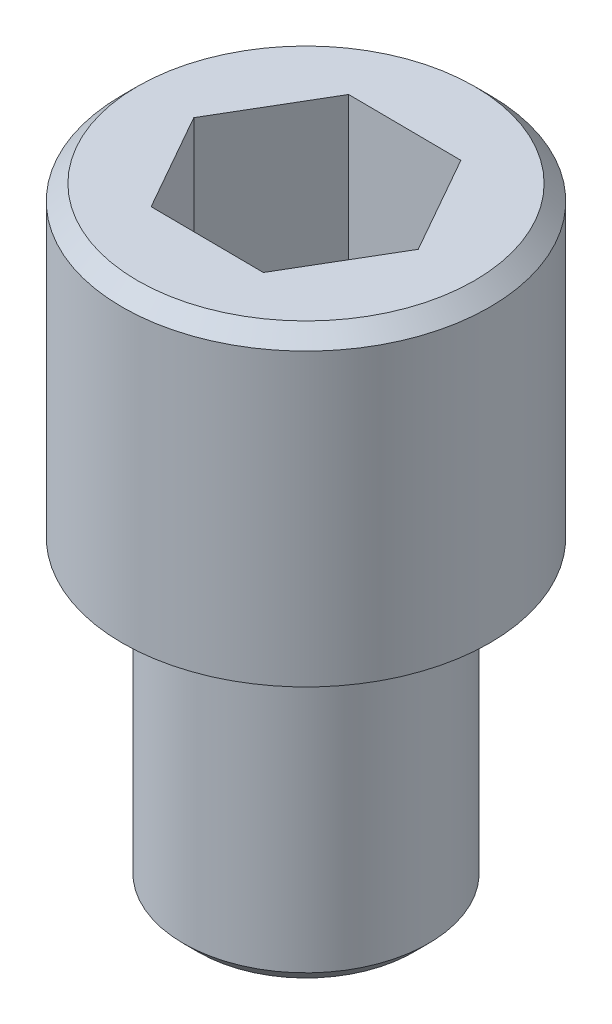
ISO-10303-21;
HEADER;
FILE_DESCRIPTION(('STEP AP214'),'2;1');
FILE_NAME('part.step','',(''),(''),'','','');
FILE_SCHEMA(('AUTOMOTIVE_DESIGN { 1 0 10303 214 1 1 1 1 }'));
ENDSEC;
DATA;
#1=APPLICATION_CONTEXT('core data for automotive mechanical design processes');
#2=APPLICATION_PROTOCOL_DEFINITION('international standard','automotive_design',2000,#1);
#3=PRODUCT_CONTEXT('',#1,'mechanical');
#4=PRODUCT('Part','Part','',(#3));
#5=PRODUCT_RELATED_PRODUCT_CATEGORY('part','',(#4));
#6=PRODUCT_DEFINITION_FORMATION('','',#4);
#7=PRODUCT_DEFINITION_CONTEXT('part definition',#1,'design');
#8=PRODUCT_DEFINITION('design','',#6,#7);
#9=PRODUCT_DEFINITION_SHAPE('','',#8);
#10=(LENGTH_UNIT() NAMED_UNIT(*) SI_UNIT(.MILLI.,.METRE.));
#11=(NAMED_UNIT(*) PLANE_ANGLE_UNIT() SI_UNIT($,.RADIAN.));
#12=(NAMED_UNIT(*) SI_UNIT($,.STERADIAN.) SOLID_ANGLE_UNIT());
#13=UNCERTAINTY_MEASURE_WITH_UNIT(LENGTH_MEASURE(1.E-05),#10,'distance_accuracy_value','');
#14=(GEOMETRIC_REPRESENTATION_CONTEXT(3) GLOBAL_UNCERTAINTY_ASSIGNED_CONTEXT((#13)) GLOBAL_UNIT_ASSIGNED_CONTEXT((#10,
#11,#12)) REPRESENTATION_CONTEXT('',''));
#15=CARTESIAN_POINT('',(0.,0.,0.));
#16=DIRECTION('',(0.,0.,1.));
#17=DIRECTION('',(1.,0.,0.));
#18=AXIS2_PLACEMENT_3D('',#15,#16,#17);
#19=CARTESIAN_POINT('',(0.,5.,0.));
#20=DIRECTION('',(0.,-1.,0.));
#21=DIRECTION('',(0.,0.,-1.));
#22=AXIS2_PLACEMENT_3D('',#19,#20,#21);
#23=CYLINDRICAL_SURFACE('',#22,2.);
#24=CARTESIAN_POINT('',(0.,0.250000000000001,0.));
#25=DIRECTION('',(0.,1.,0.));
#26=DIRECTION('',(0.,0.,1.));
#27=AXIS2_PLACEMENT_3D('',#24,#25,#26);
#28=CIRCLE('',#27,2.);
#29=CARTESIAN_POINT('',(0.,0.250000000000001,2.));
#30=VERTEX_POINT('',#29);
#31=EDGE_CURVE('E146',#30,#30,#28,.T.);
#32=ORIENTED_EDGE('',*,*,#31,.T.);
#33=EDGE_LOOP('',(#32));
#34=FACE_BOUND('',#33,.T.);
#35=CARTESIAN_POINT('',(0.,5.,0.));
#36=DIRECTION('',(0.,1.,0.));
#37=DIRECTION('',(0.,0.,1.));
#38=AXIS2_PLACEMENT_3D('',#35,#36,#37);
#39=CIRCLE('',#38,2.);
#40=CARTESIAN_POINT('',(0.,5.,2.));
#41=VERTEX_POINT('',#40);
#42=EDGE_CURVE('E143',#41,#41,#39,.T.);
#43=ORIENTED_EDGE('',*,*,#42,.F.);
#44=EDGE_LOOP('',(#43));
#45=FACE_BOUND('',#44,.T.);
#46=ADVANCED_FACE('F33',(#34,#45),#23,.T.);
#47=CARTESIAN_POINT('',(0.,0.,0.));
#48=DIRECTION('',(0.,1.,0.));
#49=DIRECTION('',(0.,0.,1.));
#50=AXIS2_PLACEMENT_3D('',#47,#48,#49);
#51=PLANE('',#50);
#52=CARTESIAN_POINT('',(0.,0.,0.));
#53=DIRECTION('',(0.,1.,0.));
#54=DIRECTION('',(0.,0.,1.));
#55=AXIS2_PLACEMENT_3D('',#52,#53,#54);
#56=CIRCLE('',#55,1.75);
#57=CARTESIAN_POINT('',(0.,0.,1.75));
#58=VERTEX_POINT('',#57);
#59=EDGE_CURVE('E149',#58,#58,#56,.F.);
#60=ORIENTED_EDGE('',*,*,#59,.T.);
#61=EDGE_LOOP('',(#60));
#62=FACE_BOUND('',#61,.T.);
#63=ADVANCED_FACE('F166',(#62),#51,.F.);
#64=CARTESIAN_POINT('',(0.,10.,0.));
#65=DIRECTION('',(0.,-1.,0.));
#66=DIRECTION('',(0.,0.,-1.));
#67=AXIS2_PLACEMENT_3D('',#64,#65,#66);
#68=CYLINDRICAL_SURFACE('',#67,3.);
#69=CARTESIAN_POINT('',(0.,9.75,0.));
#70=DIRECTION('',(0.,1.,0.));
#71=DIRECTION('',(0.,0.,1.));
#72=AXIS2_PLACEMENT_3D('',#69,#70,#71);
#73=CIRCLE('',#72,3.);
#74=CARTESIAN_POINT('',(0.,9.75,3.));
#75=VERTEX_POINT('',#74);
#76=EDGE_CURVE('E11',#75,#75,#73,.F.);
#77=ORIENTED_EDGE('',*,*,#76,.T.);
#78=EDGE_LOOP('',(#77));
#79=FACE_BOUND('',#78,.T.);
#80=CARTESIAN_POINT('',(0.,5.,0.));
#81=DIRECTION('',(0.,1.,0.));
#82=DIRECTION('',(0.,0.,1.));
#83=AXIS2_PLACEMENT_3D('',#80,#81,#82);
#84=CIRCLE('',#83,3.);
#85=CARTESIAN_POINT('',(0.,5.,3.));
#86=VERTEX_POINT('',#85);
#87=EDGE_CURVE('E135',#86,#86,#84,.T.);
#88=ORIENTED_EDGE('',*,*,#87,.T.);
#89=EDGE_LOOP('',(#88));
#90=FACE_BOUND('',#89,.T.);
#91=ADVANCED_FACE('F172',(#79,#90),#68,.T.);
#92=CARTESIAN_POINT('',(0.,10.,0.));
#93=DIRECTION('',(0.,1.,0.));
#94=DIRECTION('',(0.,0.,1.));
#95=AXIS2_PLACEMENT_3D('',#92,#93,#94);
#96=PLANE('',#95);
#97=CARTESIAN_POINT('',(0.,10.,0.));
#98=DIRECTION('',(0.,1.,0.));
#99=DIRECTION('',(0.,0.,1.));
#100=AXIS2_PLACEMENT_3D('',#97,#98,#99);
#101=CIRCLE('',#100,2.75);
#102=CARTESIAN_POINT('',(0.,10.,2.75));
#103=VERTEX_POINT('',#102);
#104=EDGE_CURVE('E41',#103,#103,#101,.T.);
#105=ORIENTED_EDGE('',*,*,#104,.T.);
#106=EDGE_LOOP('',(#105));
#107=FACE_BOUND('',#106,.T.);
#108=DIRECTION('',(0.493062744996745,0.,0.869993752561635));
#109=VECTOR('',#108,1.);
#110=CARTESIAN_POINT('',(-1.84746185778061,10.,-0.0147654115808119));
#111=LINE('',#110,#109);
#112=CARTESIAN_POINT('',(-1.84746185778061,10.,-0.0147654115808119));
#113=VERTEX_POINT('',#112);
#114=CARTESIAN_POINT('',(-0.936518150416621,10.,1.5925661955704));
#115=VERTEX_POINT('',#114);
#116=EDGE_CURVE('E48',#113,#115,#111,.T.);
#117=ORIENTED_EDGE('',*,*,#116,.F.);
#118=DIRECTION('',(-0.506905318353756,0.,0.862001739107687));
#119=VECTOR('',#118,1.);
#120=CARTESIAN_POINT('',(-0.910943707363989,10.,-1.60733160715121));
#121=LINE('',#120,#119);
#122=CARTESIAN_POINT('',(-0.910943707363989,10.,-1.60733160715121));
#123=VERTEX_POINT('',#122);
#124=EDGE_CURVE('E131',#123,#113,#121,.T.);
#125=ORIENTED_EDGE('',*,*,#124,.F.);
#126=DIRECTION('',(-0.999968063350501,0.,-0.00799201345394777));
#127=VECTOR('',#126,1.);
#128=CARTESIAN_POINT('',(0.93651815041662,10.,-1.5925661955704));
#129=LINE('',#128,#127);
#130=CARTESIAN_POINT('',(0.93651815041662,10.,-1.5925661955704));
#131=VERTEX_POINT('',#130);
#132=EDGE_CURVE('E129',#131,#123,#129,.T.);
#133=ORIENTED_EDGE('',*,*,#132,.F.);
#134=DIRECTION('',(-0.493062744996745,0.,-0.869993752561635));
#135=VECTOR('',#134,1.);
#136=CARTESIAN_POINT('',(1.84746185778061,10.,0.0147654115808117));
#137=LINE('',#136,#135);
#138=CARTESIAN_POINT('',(1.84746185778061,10.,0.0147654115808117));
#139=VERTEX_POINT('',#138);
#140=EDGE_CURVE('E96',#139,#131,#137,.T.);
#141=ORIENTED_EDGE('',*,*,#140,.F.);
#142=DIRECTION('',(0.506905318353756,0.,-0.862001739107687));
#143=VECTOR('',#142,1.);
#144=CARTESIAN_POINT('',(0.910943707363988,10.,1.60733160715121));
#145=LINE('',#144,#143);
#146=CARTESIAN_POINT('',(0.910943707363988,10.,1.60733160715121));
#147=VERTEX_POINT('',#146);
#148=EDGE_CURVE('E125',#147,#139,#145,.T.);
#149=ORIENTED_EDGE('',*,*,#148,.F.);
#150=DIRECTION('',(0.999968063350501,0.,0.00799201345394788));
#151=VECTOR('',#150,1.);
#152=CARTESIAN_POINT('',(-0.936518150416621,10.,1.5925661955704));
#153=LINE('',#152,#151);
#154=EDGE_CURVE('E122',#115,#147,#153,.T.);
#155=ORIENTED_EDGE('',*,*,#154,.F.);
#156=EDGE_LOOP('',(#117,#125,#133,#141,#149,#155));
#157=FACE_BOUND('',#156,.T.);
#158=ADVANCED_FACE('F154',(#107,#157),#96,.T.);
#159=CARTESIAN_POINT('',(0.,5.,0.));
#160=DIRECTION('',(0.,1.,0.));
#161=DIRECTION('',(0.,0.,1.));
#162=AXIS2_PLACEMENT_3D('',#159,#160,#161);
#163=PLANE('',#162);
#164=ORIENTED_EDGE('',*,*,#42,.T.);
#165=EDGE_LOOP('',(#164));
#166=FACE_BOUND('',#165,.T.);
#167=ORIENTED_EDGE('',*,*,#87,.F.);
#168=EDGE_LOOP('',(#167));
#169=FACE_BOUND('',#168,.T.);
#170=ADVANCED_FACE('F180',(#166,#169),#163,.F.);
#171=CARTESIAN_POINT('',(-1.84746185778061,7.,-0.0147654115808119));
#172=DIRECTION('',(-0.869993752561634,0.,0.493062744996745));
#173=DIRECTION('',(0.493062744996745,0.,0.869993752561635));
#174=AXIS2_PLACEMENT_3D('',#171,#172,#173);
#175=PLANE('',#174);
#176=ORIENTED_EDGE('',*,*,#116,.T.);
#177=DIRECTION('',(0.,1.,0.));
#178=VECTOR('',#177,1.);
#179=CARTESIAN_POINT('',(-0.936518150416621,7.,1.5925661955704));
#180=LINE('',#179,#178);
#181=CARTESIAN_POINT('',(-0.936518150416621,7.,1.5925661955704));
#182=VERTEX_POINT('',#181);
#183=EDGE_CURVE('E78',#182,#115,#180,.T.);
#184=ORIENTED_EDGE('',*,*,#183,.F.);
#185=DIRECTION('',(0.493062744996745,0.,0.869993752561635));
#186=VECTOR('',#185,1.);
#187=CARTESIAN_POINT('',(-1.84746185778061,7.,-0.0147654115808119));
#188=LINE('',#187,#186);
#189=CARTESIAN_POINT('',(-1.84746185778061,7.,-0.0147654115808119));
#190=VERTEX_POINT('',#189);
#191=EDGE_CURVE('E133',#190,#182,#188,.T.);
#192=ORIENTED_EDGE('',*,*,#191,.F.);
#193=DIRECTION('',(0.,1.,0.));
#194=VECTOR('',#193,1.);
#195=CARTESIAN_POINT('',(-1.84746185778061,7.,-0.0147654115808119));
#196=LINE('',#195,#194);
#197=EDGE_CURVE('E56',#190,#113,#196,.T.);
#198=ORIENTED_EDGE('',*,*,#197,.T.);
#199=EDGE_LOOP('',(#176,#184,#192,#198));
#200=FACE_BOUND('',#199,.T.);
#201=ADVANCED_FACE('F183',(#200),#175,.F.);
#202=CARTESIAN_POINT('',(-0.910943707363989,7.,-1.60733160715121));
#203=DIRECTION('',(-0.862001739107687,0.,-0.506905318353756));
#204=DIRECTION('',(-0.506905318353756,0.,0.862001739107687));
#205=AXIS2_PLACEMENT_3D('',#202,#203,#204);
#206=PLANE('',#205);
#207=ORIENTED_EDGE('',*,*,#124,.T.);
#208=ORIENTED_EDGE('',*,*,#197,.F.);
#209=DIRECTION('',(-0.506905318353756,0.,0.862001739107687));
#210=VECTOR('',#209,1.);
#211=CARTESIAN_POINT('',(-0.910943707363989,7.,-1.60733160715121));
#212=LINE('',#211,#210);
#213=CARTESIAN_POINT('',(-0.910943707363989,7.,-1.60733160715121));
#214=VERTEX_POINT('',#213);
#215=EDGE_CURVE('E108',#214,#190,#212,.T.);
#216=ORIENTED_EDGE('',*,*,#215,.F.);
#217=DIRECTION('',(0.,1.,0.));
#218=VECTOR('',#217,1.);
#219=CARTESIAN_POINT('',(-0.910943707363989,7.,-1.60733160715121));
#220=LINE('',#219,#218);
#221=EDGE_CURVE('E100',#214,#123,#220,.T.);
#222=ORIENTED_EDGE('',*,*,#221,.T.);
#223=EDGE_LOOP('',(#207,#208,#216,#222));
#224=FACE_BOUND('',#223,.T.);
#225=ADVANCED_FACE('F189',(#224),#206,.F.);
#226=CARTESIAN_POINT('',(0.93651815041662,7.,-1.5925661955704));
#227=DIRECTION('',(0.00799201345394776,0.,-0.999968063350501));
#228=DIRECTION('',(-0.999968063350501,0.,-0.00799201345394777));
#229=AXIS2_PLACEMENT_3D('',#226,#227,#228);
#230=PLANE('',#229);
#231=ORIENTED_EDGE('',*,*,#132,.T.);
#232=ORIENTED_EDGE('',*,*,#221,.F.);
#233=DIRECTION('',(-0.999968063350501,0.,-0.00799201345394777));
#234=VECTOR('',#233,1.);
#235=CARTESIAN_POINT('',(0.93651815041662,7.,-1.5925661955704));
#236=LINE('',#235,#234);
#237=CARTESIAN_POINT('',(0.93651815041662,7.,-1.5925661955704));
#238=VERTEX_POINT('',#237);
#239=EDGE_CURVE('E104',#238,#214,#236,.T.);
#240=ORIENTED_EDGE('',*,*,#239,.F.);
#241=DIRECTION('',(0.,1.,0.));
#242=VECTOR('',#241,1.);
#243=CARTESIAN_POINT('',(0.93651815041662,7.,-1.5925661955704));
#244=LINE('',#243,#242);
#245=EDGE_CURVE('E89',#238,#131,#244,.T.);
#246=ORIENTED_EDGE('',*,*,#245,.T.);
#247=EDGE_LOOP('',(#231,#232,#240,#246));
#248=FACE_BOUND('',#247,.T.);
#249=ADVANCED_FACE('F105',(#248),#230,.F.);
#250=CARTESIAN_POINT('',(1.84746185778061,7.,0.0147654115808117));
#251=DIRECTION('',(0.869993752561634,0.,-0.493062744996745));
#252=DIRECTION('',(-0.493062744996745,0.,-0.869993752561635));
#253=AXIS2_PLACEMENT_3D('',#250,#251,#252);
#254=PLANE('',#253);
#255=ORIENTED_EDGE('',*,*,#140,.T.);
#256=ORIENTED_EDGE('',*,*,#245,.F.);
#257=DIRECTION('',(-0.493062744996745,0.,-0.869993752561635));
#258=VECTOR('',#257,1.);
#259=CARTESIAN_POINT('',(1.84746185778061,7.,0.0147654115808117));
#260=LINE('',#259,#258);
#261=CARTESIAN_POINT('',(1.84746185778061,7.,0.0147654115808117));
#262=VERTEX_POINT('',#261);
#263=EDGE_CURVE('E93',#262,#238,#260,.T.);
#264=ORIENTED_EDGE('',*,*,#263,.F.);
#265=DIRECTION('',(0.,1.,0.));
#266=VECTOR('',#265,1.);
#267=CARTESIAN_POINT('',(1.84746185778061,7.,0.0147654115808117));
#268=LINE('',#267,#266);
#269=EDGE_CURVE('E101',#262,#139,#268,.T.);
#270=ORIENTED_EDGE('',*,*,#269,.T.);
#271=EDGE_LOOP('',(#255,#256,#264,#270));
#272=FACE_BOUND('',#271,.T.);
#273=ADVANCED_FACE('F91',(#272),#254,.F.);
#274=CARTESIAN_POINT('',(0.910943707363988,7.,1.60733160715121));
#275=DIRECTION('',(0.862001739107687,0.,0.506905318353756));
#276=DIRECTION('',(0.506905318353756,0.,-0.862001739107687));
#277=AXIS2_PLACEMENT_3D('',#274,#275,#276);
#278=PLANE('',#277);
#279=ORIENTED_EDGE('',*,*,#148,.T.);
#280=ORIENTED_EDGE('',*,*,#269,.F.);
#281=DIRECTION('',(0.506905318353756,0.,-0.862001739107687));
#282=VECTOR('',#281,1.);
#283=CARTESIAN_POINT('',(0.910943707363988,7.,1.60733160715121));
#284=LINE('',#283,#282);
#285=CARTESIAN_POINT('',(0.910943707363988,7.,1.60733160715121));
#286=VERTEX_POINT('',#285);
#287=EDGE_CURVE('E114',#286,#262,#284,.T.);
#288=ORIENTED_EDGE('',*,*,#287,.F.);
#289=DIRECTION('',(0.,1.,0.));
#290=VECTOR('',#289,1.);
#291=CARTESIAN_POINT('',(0.910943707363988,7.,1.60733160715121));
#292=LINE('',#291,#290);
#293=EDGE_CURVE('E138',#286,#147,#292,.T.);
#294=ORIENTED_EDGE('',*,*,#293,.T.);
#295=EDGE_LOOP('',(#279,#280,#288,#294));
#296=FACE_BOUND('',#295,.T.);
#297=ADVANCED_FACE('F193',(#296),#278,.F.);
#298=CARTESIAN_POINT('',(-0.936518150416621,7.,1.5925661955704));
#299=DIRECTION('',(-0.00799201345394788,0.,0.999968063350501));
#300=DIRECTION('',(0.999968063350501,0.,0.00799201345394788));
#301=AXIS2_PLACEMENT_3D('',#298,#299,#300);
#302=PLANE('',#301);
#303=ORIENTED_EDGE('',*,*,#154,.T.);
#304=ORIENTED_EDGE('',*,*,#293,.F.);
#305=DIRECTION('',(0.999968063350501,0.,0.00799201345394788));
#306=VECTOR('',#305,1.);
#307=CARTESIAN_POINT('',(-0.936518150416621,7.,1.5925661955704));
#308=LINE('',#307,#306);
#309=EDGE_CURVE('E116',#182,#286,#308,.T.);
#310=ORIENTED_EDGE('',*,*,#309,.F.);
#311=ORIENTED_EDGE('',*,*,#183,.T.);
#312=EDGE_LOOP('',(#303,#304,#310,#311));
#313=FACE_BOUND('',#312,.T.);
#314=ADVANCED_FACE('F190',(#313),#302,.F.);
#315=CARTESIAN_POINT('',(0.,7.,0.));
#316=DIRECTION('',(0.,1.,0.));
#317=DIRECTION('',(0.,0.,1.));
#318=AXIS2_PLACEMENT_3D('',#315,#316,#317);
#319=PLANE('',#318);
#320=ORIENTED_EDGE('',*,*,#191,.T.);
#321=ORIENTED_EDGE('',*,*,#309,.T.);
#322=ORIENTED_EDGE('',*,*,#287,.T.);
#323=ORIENTED_EDGE('',*,*,#263,.T.);
#324=ORIENTED_EDGE('',*,*,#239,.T.);
#325=ORIENTED_EDGE('',*,*,#215,.T.);
#326=EDGE_LOOP('',(#320,#321,#322,#323,#324,#325));
#327=FACE_BOUND('',#326,.T.);
#328=ADVANCED_FACE('F111',(#327),#319,.T.);
#329=CARTESIAN_POINT('',(0.,0.250000000000001,0.));
#330=DIRECTION('',(0.,1.,0.));
#331=DIRECTION('',(0.,0.,1.));
#332=AXIS2_PLACEMENT_3D('',#329,#330,#331);
#333=CONICAL_SURFACE('',#332,2.,0.785398163397452);
#334=ORIENTED_EDGE('',*,*,#59,.F.);
#335=EDGE_LOOP('',(#334));
#336=FACE_BOUND('',#335,.T.);
#337=ORIENTED_EDGE('',*,*,#31,.F.);
#338=EDGE_LOOP('',(#337));
#339=FACE_BOUND('',#338,.T.);
#340=ADVANCED_FACE('F158',(#336,#339),#333,.T.);
#341=CARTESIAN_POINT('',(0.,10.,0.));
#342=DIRECTION('',(0.,-1.,0.));
#343=DIRECTION('',(0.,0.,-1.));
#344=AXIS2_PLACEMENT_3D('',#341,#342,#343);
#345=CONICAL_SURFACE('',#344,2.75,0.785398163397447);
#346=ORIENTED_EDGE('',*,*,#76,.F.);
#347=EDGE_LOOP('',(#346));
#348=FACE_BOUND('',#347,.T.);
#349=ORIENTED_EDGE('',*,*,#104,.F.);
#350=EDGE_LOOP('',(#349));
#351=FACE_BOUND('',#350,.T.);
#352=ADVANCED_FACE('F35',(#348,#351),#345,.T.);
#353=CLOSED_SHELL('',(#46,#63,#91,#158,#170,#201,#225,#249,#273,#297,#314,#328,#340,#352));
#354=MANIFOLD_SOLID_BREP('B2',#353);
#355=ADVANCED_BREP_SHAPE_REPRESENTATION('',(#18,#354),#14);
#356=SHAPE_DEFINITION_REPRESENTATION(#9,#355);
ENDSEC;
END-ISO-10303-21;
